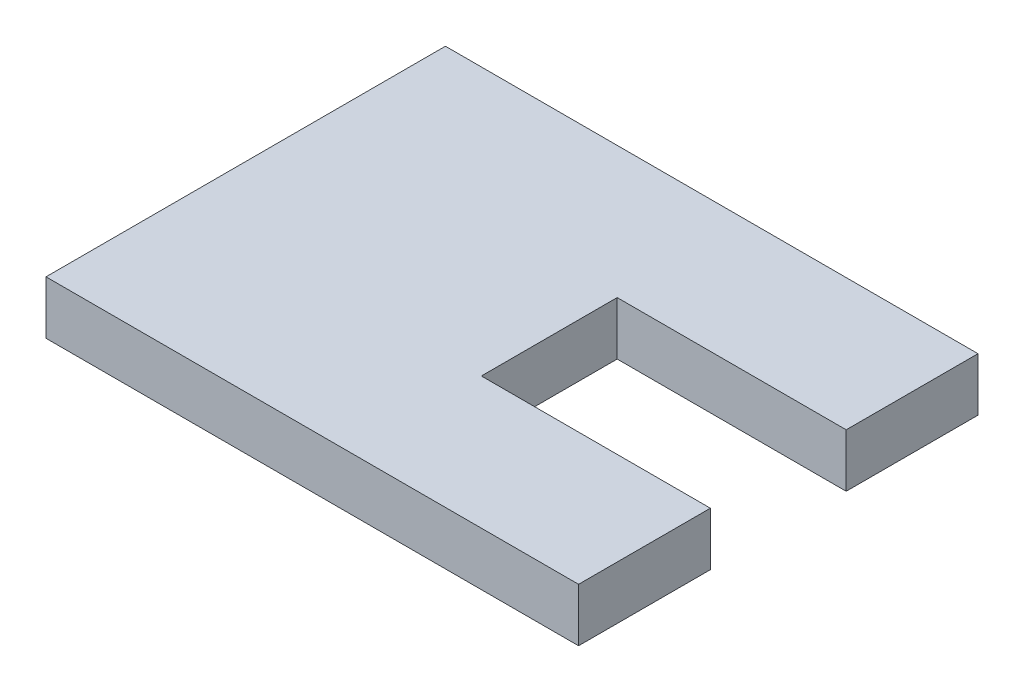
ISO-10303-21;
HEADER;
FILE_DESCRIPTION(('STEP AP214'),'2;1');
FILE_NAME('part.step','',(''),(''),'','','');
FILE_SCHEMA(('AUTOMOTIVE_DESIGN { 1 0 10303 214 1 1 1 1 }'));
ENDSEC;
DATA;
#1=APPLICATION_CONTEXT('core data for automotive mechanical design processes');
#2=APPLICATION_PROTOCOL_DEFINITION('international standard','automotive_design',2000,#1);
#3=PRODUCT_CONTEXT('',#1,'mechanical');
#4=PRODUCT('Part','Part','',(#3));
#5=PRODUCT_RELATED_PRODUCT_CATEGORY('part','',(#4));
#6=PRODUCT_DEFINITION_FORMATION('','',#4);
#7=PRODUCT_DEFINITION_CONTEXT('part definition',#1,'design');
#8=PRODUCT_DEFINITION('design','',#6,#7);
#9=PRODUCT_DEFINITION_SHAPE('','',#8);
#10=(LENGTH_UNIT() NAMED_UNIT(*) SI_UNIT(.MILLI.,.METRE.));
#11=(NAMED_UNIT(*) PLANE_ANGLE_UNIT() SI_UNIT($,.RADIAN.));
#12=(NAMED_UNIT(*) SI_UNIT($,.STERADIAN.) SOLID_ANGLE_UNIT());
#13=UNCERTAINTY_MEASURE_WITH_UNIT(LENGTH_MEASURE(1.E-05),#10,'distance_accuracy_value','');
#14=(GEOMETRIC_REPRESENTATION_CONTEXT(3) GLOBAL_UNCERTAINTY_ASSIGNED_CONTEXT((#13)) GLOBAL_UNIT_ASSIGNED_CONTEXT((#10,
#11,#12)) REPRESENTATION_CONTEXT('',''));
#15=CARTESIAN_POINT('',(0.,0.,0.));
#16=DIRECTION('',(0.,0.,1.));
#17=DIRECTION('',(1.,0.,0.));
#18=AXIS2_PLACEMENT_3D('',#15,#16,#17);
#19=CARTESIAN_POINT('',(40.,4.,0.));
#20=DIRECTION('',(-1.,0.,0.));
#21=DIRECTION('',(0.,0.,1.));
#22=AXIS2_PLACEMENT_3D('',#19,#20,#21);
#23=PLANE('',#22);
#24=DIRECTION('',(0.,1.,0.));
#25=VECTOR('',#24,1.);
#26=CARTESIAN_POINT('',(40.,-6.,-9.90000000000001));
#27=LINE('',#26,#25);
#28=CARTESIAN_POINT('',(40.,0.,-9.90000000000001));
#29=VERTEX_POINT('',#28);
#30=CARTESIAN_POINT('',(40.,4.,-9.90000000000001));
#31=VERTEX_POINT('',#30);
#32=EDGE_CURVE('E132',#29,#31,#27,.T.);
#33=ORIENTED_EDGE('',*,*,#32,.T.);
#34=DIRECTION('',(0.,0.,-1.));
#35=VECTOR('',#34,1.);
#36=CARTESIAN_POINT('',(40.,4.,0.));
#37=LINE('',#36,#35);
#38=CARTESIAN_POINT('',(40.,4.,0.));
#39=VERTEX_POINT('',#38);
#40=EDGE_CURVE('E189',#39,#31,#37,.T.);
#41=ORIENTED_EDGE('',*,*,#40,.F.);
#42=DIRECTION('',(0.,-1.,0.));
#43=VECTOR('',#42,1.);
#44=CARTESIAN_POINT('',(40.,4.,0.));
#45=LINE('',#44,#43);
#46=CARTESIAN_POINT('',(40.,0.,0.));
#47=VERTEX_POINT('',#46);
#48=EDGE_CURVE('E144',#39,#47,#45,.T.);
#49=ORIENTED_EDGE('',*,*,#48,.T.);
#50=DIRECTION('',(0.,0.,-1.));
#51=VECTOR('',#50,1.);
#52=CARTESIAN_POINT('',(40.,0.,0.));
#53=LINE('',#52,#51);
#54=EDGE_CURVE('E143',#47,#29,#53,.T.);
#55=ORIENTED_EDGE('',*,*,#54,.T.);
#56=EDGE_LOOP('',(#33,#41,#49,#55));
#57=FACE_BOUND('',#56,.T.);
#58=ADVANCED_FACE('F39',(#57),#23,.F.);
#59=CARTESIAN_POINT('',(0.,4.,0.));
#60=DIRECTION('',(0.,-1.,0.));
#61=DIRECTION('',(0.,0.,-1.));
#62=AXIS2_PLACEMENT_3D('',#59,#60,#61);
#63=PLANE('',#62);
#64=DIRECTION('',(-1.,0.,0.));
#65=VECTOR('',#64,1.);
#66=CARTESIAN_POINT('',(40.,4.,-9.90000000000001));
#67=LINE('',#66,#65);
#68=CARTESIAN_POINT('',(22.8,4.,-9.9));
#69=VERTEX_POINT('',#68);
#70=EDGE_CURVE('E134',#31,#69,#67,.T.);
#71=ORIENTED_EDGE('',*,*,#70,.T.);
#72=DIRECTION('',(0.,0.,1.));
#73=VECTOR('',#72,1.);
#74=CARTESIAN_POINT('',(22.8,4.,-20.1));
#75=LINE('',#74,#73);
#76=CARTESIAN_POINT('',(22.8,4.,-20.1));
#77=VERTEX_POINT('',#76);
#78=EDGE_CURVE('E125',#77,#69,#75,.T.);
#79=ORIENTED_EDGE('',*,*,#78,.F.);
#80=DIRECTION('',(-1.,0.,0.));
#81=VECTOR('',#80,1.);
#82=CARTESIAN_POINT('',(40.,4.,-20.1));
#83=LINE('',#82,#81);
#84=CARTESIAN_POINT('',(40.,4.,-20.1));
#85=VERTEX_POINT('',#84);
#86=EDGE_CURVE('E178',#85,#77,#83,.T.);
#87=ORIENTED_EDGE('',*,*,#86,.F.);
#88=CARTESIAN_POINT('',(40.,4.,-30.));
#89=VERTEX_POINT('',#88);
#90=EDGE_CURVE('E176',#85,#89,#37,.T.);
#91=ORIENTED_EDGE('',*,*,#90,.T.);
#92=DIRECTION('',(-1.,0.,0.));
#93=VECTOR('',#92,1.);
#94=CARTESIAN_POINT('',(0.,4.,-30.));
#95=LINE('',#94,#93);
#96=CARTESIAN_POINT('',(0.,4.,-30.));
#97=VERTEX_POINT('',#96);
#98=EDGE_CURVE('E64',#89,#97,#95,.T.);
#99=ORIENTED_EDGE('',*,*,#98,.T.);
#100=DIRECTION('',(0.,0.,1.));
#101=VECTOR('',#100,1.);
#102=CARTESIAN_POINT('',(0.,4.,0.));
#103=LINE('',#102,#101);
#104=CARTESIAN_POINT('',(0.,4.,0.));
#105=VERTEX_POINT('',#104);
#106=EDGE_CURVE('E150',#97,#105,#103,.T.);
#107=ORIENTED_EDGE('',*,*,#106,.T.);
#108=DIRECTION('',(1.,0.,0.));
#109=VECTOR('',#108,1.);
#110=CARTESIAN_POINT('',(0.,4.,0.));
#111=LINE('',#110,#109);
#112=EDGE_CURVE('E93',#105,#39,#111,.T.);
#113=ORIENTED_EDGE('',*,*,#112,.T.);
#114=ORIENTED_EDGE('',*,*,#40,.T.);
#115=EDGE_LOOP('',(#71,#79,#87,#91,#99,#107,#113,#114));
#116=FACE_BOUND('',#115,.T.);
#117=ADVANCED_FACE('F203',(#116),#63,.F.);
#118=CARTESIAN_POINT('',(0.,0.,0.));
#119=DIRECTION('',(0.,-1.,0.));
#120=DIRECTION('',(0.,0.,-1.));
#121=AXIS2_PLACEMENT_3D('',#118,#119,#120);
#122=PLANE('',#121);
#123=DIRECTION('',(0.,0.,-1.));
#124=VECTOR('',#123,1.);
#125=CARTESIAN_POINT('',(22.8,0.,-9.9));
#126=LINE('',#125,#124);
#127=CARTESIAN_POINT('',(22.8,0.,-9.9));
#128=VERTEX_POINT('',#127);
#129=CARTESIAN_POINT('',(22.8,0.,-20.1));
#130=VERTEX_POINT('',#129);
#131=EDGE_CURVE('E55',#128,#130,#126,.T.);
#132=ORIENTED_EDGE('',*,*,#131,.F.);
#133=DIRECTION('',(1.,0.,0.));
#134=VECTOR('',#133,1.);
#135=CARTESIAN_POINT('',(0.,0.,-9.9));
#136=LINE('',#135,#134);
#137=EDGE_CURVE('E11',#128,#29,#136,.T.);
#138=ORIENTED_EDGE('',*,*,#137,.T.);
#139=ORIENTED_EDGE('',*,*,#54,.F.);
#140=DIRECTION('',(1.,0.,0.));
#141=VECTOR('',#140,1.);
#142=CARTESIAN_POINT('',(0.,0.,0.));
#143=LINE('',#142,#141);
#144=CARTESIAN_POINT('',(0.,0.,0.));
#145=VERTEX_POINT('',#144);
#146=EDGE_CURVE('E152',#145,#47,#143,.T.);
#147=ORIENTED_EDGE('',*,*,#146,.F.);
#148=DIRECTION('',(0.,0.,1.));
#149=VECTOR('',#148,1.);
#150=CARTESIAN_POINT('',(0.,0.,0.));
#151=LINE('',#150,#149);
#152=CARTESIAN_POINT('',(0.,0.,-30.));
#153=VERTEX_POINT('',#152);
#154=EDGE_CURVE('E139',#153,#145,#151,.T.);
#155=ORIENTED_EDGE('',*,*,#154,.F.);
#156=DIRECTION('',(-1.,0.,0.));
#157=VECTOR('',#156,1.);
#158=CARTESIAN_POINT('',(0.,0.,-30.));
#159=LINE('',#158,#157);
#160=CARTESIAN_POINT('',(40.,0.,-30.));
#161=VERTEX_POINT('',#160);
#162=EDGE_CURVE('E85',#161,#153,#159,.T.);
#163=ORIENTED_EDGE('',*,*,#162,.F.);
#164=CARTESIAN_POINT('',(40.,0.,-20.1));
#165=VERTEX_POINT('',#164);
#166=EDGE_CURVE('E146',#165,#161,#53,.T.);
#167=ORIENTED_EDGE('',*,*,#166,.F.);
#168=DIRECTION('',(1.,0.,0.));
#169=VECTOR('',#168,1.);
#170=CARTESIAN_POINT('',(0.,0.,-20.1));
#171=LINE('',#170,#169);
#172=EDGE_CURVE('E48',#130,#165,#171,.T.);
#173=ORIENTED_EDGE('',*,*,#172,.F.);
#174=EDGE_LOOP('',(#132,#138,#139,#147,#155,#163,#167,#173));
#175=FACE_BOUND('',#174,.T.);
#176=ADVANCED_FACE('F113',(#175),#122,.T.);
#177=CARTESIAN_POINT('',(0.,4.,0.));
#178=DIRECTION('',(1.,0.,0.));
#179=DIRECTION('',(0.,0.,-1.));
#180=AXIS2_PLACEMENT_3D('',#177,#178,#179);
#181=PLANE('',#180);
#182=ORIENTED_EDGE('',*,*,#154,.T.);
#183=DIRECTION('',(0.,-1.,0.));
#184=VECTOR('',#183,1.);
#185=CARTESIAN_POINT('',(0.,4.,0.));
#186=LINE('',#185,#184);
#187=EDGE_CURVE('E164',#105,#145,#186,.T.);
#188=ORIENTED_EDGE('',*,*,#187,.F.);
#189=ORIENTED_EDGE('',*,*,#106,.F.);
#190=DIRECTION('',(0.,-1.,0.));
#191=VECTOR('',#190,1.);
#192=CARTESIAN_POINT('',(0.,4.,-30.));
#193=LINE('',#192,#191);
#194=EDGE_CURVE('E156',#97,#153,#193,.T.);
#195=ORIENTED_EDGE('',*,*,#194,.T.);
#196=EDGE_LOOP('',(#182,#188,#189,#195));
#197=FACE_BOUND('',#196,.T.);
#198=ADVANCED_FACE('F41',(#197),#181,.F.);
#199=CARTESIAN_POINT('',(0.,4.,0.));
#200=DIRECTION('',(0.,0.,-1.));
#201=DIRECTION('',(-1.,0.,0.));
#202=AXIS2_PLACEMENT_3D('',#199,#200,#201);
#203=PLANE('',#202);
#204=ORIENTED_EDGE('',*,*,#146,.T.);
#205=ORIENTED_EDGE('',*,*,#48,.F.);
#206=ORIENTED_EDGE('',*,*,#112,.F.);
#207=ORIENTED_EDGE('',*,*,#187,.T.);
#208=EDGE_LOOP('',(#204,#205,#206,#207));
#209=FACE_BOUND('',#208,.T.);
#210=ADVANCED_FACE('F205',(#209),#203,.F.);
#211=ORIENTED_EDGE('',*,*,#90,.F.);
#212=DIRECTION('',(0.,1.,0.));
#213=VECTOR('',#212,1.);
#214=CARTESIAN_POINT('',(40.,-6.,-20.1));
#215=LINE('',#214,#213);
#216=EDGE_CURVE('E140',#165,#85,#215,.T.);
#217=ORIENTED_EDGE('',*,*,#216,.F.);
#218=ORIENTED_EDGE('',*,*,#166,.T.);
#219=DIRECTION('',(0.,-1.,0.));
#220=VECTOR('',#219,1.);
#221=CARTESIAN_POINT('',(40.,4.,-30.));
#222=LINE('',#221,#220);
#223=EDGE_CURVE('E159',#89,#161,#222,.T.);
#224=ORIENTED_EDGE('',*,*,#223,.F.);
#225=EDGE_LOOP('',(#211,#217,#218,#224));
#226=FACE_BOUND('',#225,.T.);
#227=ADVANCED_FACE('F174',(#226),#23,.F.);
#228=CARTESIAN_POINT('',(0.,4.,-30.));
#229=DIRECTION('',(0.,0.,1.));
#230=DIRECTION('',(1.,0.,0.));
#231=AXIS2_PLACEMENT_3D('',#228,#229,#230);
#232=PLANE('',#231);
#233=ORIENTED_EDGE('',*,*,#162,.T.);
#234=ORIENTED_EDGE('',*,*,#194,.F.);
#235=ORIENTED_EDGE('',*,*,#98,.F.);
#236=ORIENTED_EDGE('',*,*,#223,.T.);
#237=EDGE_LOOP('',(#233,#234,#235,#236));
#238=FACE_BOUND('',#237,.T.);
#239=ADVANCED_FACE('F206',(#238),#232,.F.);
#240=CARTESIAN_POINT('',(40.,-6.,-9.90000000000001));
#241=DIRECTION('',(0.,0.,-1.));
#242=DIRECTION('',(-1.,0.,0.));
#243=AXIS2_PLACEMENT_3D('',#240,#241,#242);
#244=PLANE('',#243);
#245=DIRECTION('',(0.,-1.,0.));
#246=VECTOR('',#245,1.);
#247=CARTESIAN_POINT('',(22.8,4.,-9.9));
#248=LINE('',#247,#246);
#249=EDGE_CURVE('E120',#69,#128,#248,.T.);
#250=ORIENTED_EDGE('',*,*,#249,.F.);
#251=ORIENTED_EDGE('',*,*,#70,.F.);
#252=ORIENTED_EDGE('',*,*,#32,.F.);
#253=ORIENTED_EDGE('',*,*,#137,.F.);
#254=EDGE_LOOP('',(#250,#251,#252,#253));
#255=FACE_BOUND('',#254,.T.);
#256=ADVANCED_FACE('F130',(#255),#244,.T.);
#257=CARTESIAN_POINT('',(40.,-6.,-20.1));
#258=DIRECTION('',(0.,0.,-1.));
#259=DIRECTION('',(-1.,0.,0.));
#260=AXIS2_PLACEMENT_3D('',#257,#258,#259);
#261=PLANE('',#260);
#262=ORIENTED_EDGE('',*,*,#86,.T.);
#263=DIRECTION('',(0.,1.,0.));
#264=VECTOR('',#263,1.);
#265=CARTESIAN_POINT('',(22.8,0.,-20.1));
#266=LINE('',#265,#264);
#267=EDGE_CURVE('E119',#130,#77,#266,.T.);
#268=ORIENTED_EDGE('',*,*,#267,.F.);
#269=ORIENTED_EDGE('',*,*,#172,.T.);
#270=ORIENTED_EDGE('',*,*,#216,.T.);
#271=EDGE_LOOP('',(#262,#268,#269,#270));
#272=FACE_BOUND('',#271,.T.);
#273=ADVANCED_FACE('F170',(#272),#261,.F.);
#274=CARTESIAN_POINT('',(22.8,0.,0.));
#275=DIRECTION('',(1.,0.,0.));
#276=DIRECTION('',(0.,0.,-1.));
#277=AXIS2_PLACEMENT_3D('',#274,#275,#276);
#278=PLANE('',#277);
#279=ORIENTED_EDGE('',*,*,#249,.T.);
#280=ORIENTED_EDGE('',*,*,#131,.T.);
#281=ORIENTED_EDGE('',*,*,#267,.T.);
#282=ORIENTED_EDGE('',*,*,#78,.T.);
#283=EDGE_LOOP('',(#279,#280,#281,#282));
#284=FACE_BOUND('',#283,.T.);
#285=ADVANCED_FACE('F123',(#284),#278,.T.);
#286=CLOSED_SHELL('',(#58,#117,#176,#198,#210,#227,#239,#256,#273,#285));
#287=MANIFOLD_SOLID_BREP('B2',#286);
#288=ADVANCED_BREP_SHAPE_REPRESENTATION('',(#18,#287),#14);
#289=SHAPE_DEFINITION_REPRESENTATION(#9,#288);
ENDSEC;
END-ISO-10303-21;
